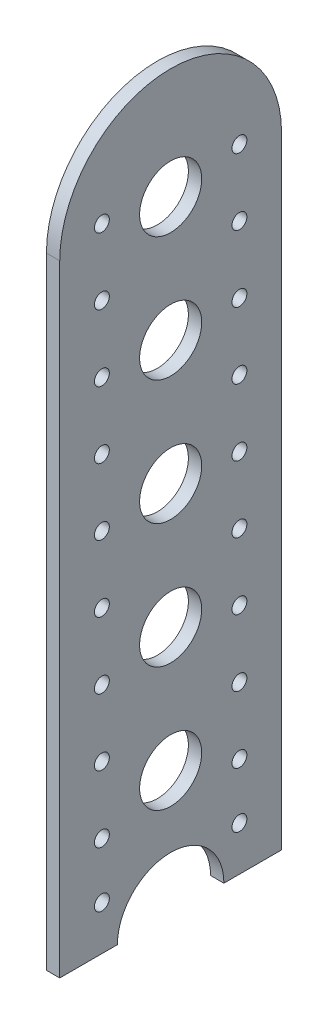
ISO-10303-21;
HEADER;
FILE_DESCRIPTION(('STEP AP214'),'2;1');
FILE_NAME('part.step','',(''),(''),'','','');
FILE_SCHEMA(('AUTOMOTIVE_DESIGN { 1 0 10303 214 1 1 1 1 }'));
ENDSEC;
DATA;
#1=APPLICATION_CONTEXT('core data for automotive mechanical design processes');
#2=APPLICATION_PROTOCOL_DEFINITION('international standard','automotive_design',2000,#1);
#3=PRODUCT_CONTEXT('',#1,'mechanical');
#4=PRODUCT('Part','Part','',(#3));
#5=PRODUCT_RELATED_PRODUCT_CATEGORY('part','',(#4));
#6=PRODUCT_DEFINITION_FORMATION('','',#4);
#7=PRODUCT_DEFINITION_CONTEXT('part definition',#1,'design');
#8=PRODUCT_DEFINITION('design','',#6,#7);
#9=PRODUCT_DEFINITION_SHAPE('','',#8);
#10=(LENGTH_UNIT() NAMED_UNIT(*) SI_UNIT(.MILLI.,.METRE.));
#11=(NAMED_UNIT(*) PLANE_ANGLE_UNIT() SI_UNIT($,.RADIAN.));
#12=(NAMED_UNIT(*) SI_UNIT($,.STERADIAN.) SOLID_ANGLE_UNIT());
#13=UNCERTAINTY_MEASURE_WITH_UNIT(LENGTH_MEASURE(1.E-05),#10,'distance_accuracy_value','');
#14=(GEOMETRIC_REPRESENTATION_CONTEXT(3) GLOBAL_UNCERTAINTY_ASSIGNED_CONTEXT((#13)) GLOBAL_UNIT_ASSIGNED_CONTEXT((#10,
#11,#12)) REPRESENTATION_CONTEXT('',''));
#15=CARTESIAN_POINT('',(0.,0.,0.));
#16=DIRECTION('',(0.,0.,1.));
#17=DIRECTION('',(1.,0.,0.));
#18=AXIS2_PLACEMENT_3D('',#15,#16,#17);
#19=CARTESIAN_POINT('',(3.,56.0448045342148,0.0948683352719054));
#20=DIRECTION('',(1.,0.,0.));
#21=DIRECTION('',(0.,0.,-1.));
#22=AXIS2_PLACEMENT_3D('',#19,#20,#21);
#23=PLANE('',#22);
#24=CARTESIAN_POINT('',(3.,-16.4551960618316,-15.4051320372575));
#25=DIRECTION('',(1.,0.,0.));
#26=DIRECTION('',(0.,0.,-1.));
#27=AXIS2_PLACEMENT_3D('',#24,#25,#26);
#28=CIRCLE('',#27,1.68);
#29=CARTESIAN_POINT('',(3.,-16.4551960618316,-17.0851320372574));
#30=VERTEX_POINT('',#29);
#31=EDGE_CURVE('E327',#30,#30,#28,.T.);
#32=ORIENTED_EDGE('',*,*,#31,.F.);
#33=EDGE_LOOP('',(#32));
#34=FACE_BOUND('',#33,.T.);
#35=CARTESIAN_POINT('',(3.,-1.45519606183174,15.5948687078011));
#36=DIRECTION('',(1.,0.,0.));
#37=DIRECTION('',(0.,0.,-1.));
#38=AXIS2_PLACEMENT_3D('',#35,#36,#37);
#39=CIRCLE('',#38,1.68);
#40=CARTESIAN_POINT('',(3.,-1.45519606183174,13.9148687078011));
#41=VERTEX_POINT('',#40);
#42=EDGE_CURVE('E314',#41,#41,#39,.T.);
#43=ORIENTED_EDGE('',*,*,#42,.F.);
#44=EDGE_LOOP('',(#43));
#45=FACE_BOUND('',#44,.T.);
#46=CARTESIAN_POINT('',(3.,-1.45519606183164,-15.4051320372574));
#47=DIRECTION('',(1.,0.,0.));
#48=DIRECTION('',(0.,0.,-1.));
#49=AXIS2_PLACEMENT_3D('',#46,#47,#48);
#50=CIRCLE('',#49,1.68);
#51=CARTESIAN_POINT('',(3.,-1.45519606183164,-17.0851320372574));
#52=VERTEX_POINT('',#51);
#53=EDGE_CURVE('E315',#52,#52,#50,.T.);
#54=ORIENTED_EDGE('',*,*,#53,.F.);
#55=EDGE_LOOP('',(#54));
#56=FACE_BOUND('',#55,.T.);
#57=CARTESIAN_POINT('',(3.,13.5448039381683,15.5948687078012));
#58=DIRECTION('',(1.,0.,0.));
#59=DIRECTION('',(0.,0.,-1.));
#60=AXIS2_PLACEMENT_3D('',#57,#58,#59);
#61=CIRCLE('',#60,1.68);
#62=CARTESIAN_POINT('',(3.,13.5448039381683,13.9148687078012));
#63=VERTEX_POINT('',#62);
#64=EDGE_CURVE('E302',#63,#63,#61,.T.);
#65=ORIENTED_EDGE('',*,*,#64,.F.);
#66=EDGE_LOOP('',(#65));
#67=FACE_BOUND('',#66,.T.);
#68=CARTESIAN_POINT('',(3.,-46.4551960618316,-15.4051320372576));
#69=DIRECTION('',(1.,0.,0.));
#70=DIRECTION('',(0.,0.,-1.));
#71=AXIS2_PLACEMENT_3D('',#68,#69,#70);
#72=CIRCLE('',#71,1.68);
#73=CARTESIAN_POINT('',(3.,-46.4551960618316,-17.0851320372576));
#74=VERTEX_POINT('',#73);
#75=EDGE_CURVE('E351',#74,#74,#72,.T.);
#76=ORIENTED_EDGE('',*,*,#75,.F.);
#77=EDGE_LOOP('',(#76));
#78=FACE_BOUND('',#77,.T.);
#79=CARTESIAN_POINT('',(3.,-31.4551960618317,15.594868707801));
#80=DIRECTION('',(1.,0.,0.));
#81=DIRECTION('',(0.,0.,-1.));
#82=AXIS2_PLACEMENT_3D('',#79,#80,#81);
#83=CIRCLE('',#82,1.68);
#84=CARTESIAN_POINT('',(3.,-31.4551960618317,13.914868707801));
#85=VERTEX_POINT('',#84);
#86=EDGE_CURVE('E338',#85,#85,#83,.T.);
#87=ORIENTED_EDGE('',*,*,#86,.F.);
#88=EDGE_LOOP('',(#87));
#89=FACE_BOUND('',#88,.T.);
#90=CARTESIAN_POINT('',(3.,-31.4551960618316,-15.4051320372575));
#91=DIRECTION('',(1.,0.,0.));
#92=DIRECTION('',(0.,0.,-1.));
#93=AXIS2_PLACEMENT_3D('',#90,#91,#92);
#94=CIRCLE('',#93,1.68);
#95=CARTESIAN_POINT('',(3.,-31.4551960618316,-17.0851320372575));
#96=VERTEX_POINT('',#95);
#97=EDGE_CURVE('E339',#96,#96,#94,.T.);
#98=ORIENTED_EDGE('',*,*,#97,.F.);
#99=EDGE_LOOP('',(#98));
#100=FACE_BOUND('',#99,.T.);
#101=CARTESIAN_POINT('',(3.,-16.4551960618317,15.5948687078011));
#102=DIRECTION('',(1.,0.,0.));
#103=DIRECTION('',(0.,0.,-1.));
#104=AXIS2_PLACEMENT_3D('',#101,#102,#103);
#105=CIRCLE('',#104,1.68);
#106=CARTESIAN_POINT('',(3.,-16.4551960618317,13.9148687078011));
#107=VERTEX_POINT('',#106);
#108=EDGE_CURVE('E326',#107,#107,#105,.T.);
#109=ORIENTED_EDGE('',*,*,#108,.F.);
#110=EDGE_LOOP('',(#109));
#111=FACE_BOUND('',#110,.T.);
#112=CARTESIAN_POINT('',(3.,43.5448039381684,-15.4051320372572));
#113=DIRECTION('',(1.,0.,0.));
#114=DIRECTION('',(0.,0.,-1.));
#115=AXIS2_PLACEMENT_3D('',#112,#113,#114);
#116=CIRCLE('',#115,1.68);
#117=CARTESIAN_POINT('',(3.,43.5448039381684,-17.0851320372572));
#118=VERTEX_POINT('',#117);
#119=EDGE_CURVE('E279',#118,#118,#116,.T.);
#120=ORIENTED_EDGE('',*,*,#119,.F.);
#121=EDGE_LOOP('',(#120));
#122=FACE_BOUND('',#121,.T.);
#123=CARTESIAN_POINT('',(3.,58.5448039381683,15.5948687078014));
#124=DIRECTION('',(1.,0.,0.));
#125=DIRECTION('',(0.,0.,-1.));
#126=AXIS2_PLACEMENT_3D('',#123,#124,#125);
#127=CIRCLE('',#126,1.68);
#128=CARTESIAN_POINT('',(3.,58.5448039381683,13.9148687078013));
#129=VERTEX_POINT('',#128);
#130=EDGE_CURVE('E272',#129,#129,#127,.T.);
#131=ORIENTED_EDGE('',*,*,#130,.F.);
#132=EDGE_LOOP('',(#131));
#133=FACE_BOUND('',#132,.T.);
#134=CARTESIAN_POINT('',(3.,58.5448039381684,-15.4051320372572));
#135=DIRECTION('',(1.,0.,0.));
#136=DIRECTION('',(0.,0.,-1.));
#137=AXIS2_PLACEMENT_3D('',#134,#135,#136);
#138=CIRCLE('',#137,1.68);
#139=CARTESIAN_POINT('',(3.,58.5448039381684,-17.0851320372572));
#140=VERTEX_POINT('',#139);
#141=EDGE_CURVE('E269',#140,#140,#138,.T.);
#142=ORIENTED_EDGE('',*,*,#141,.F.);
#143=EDGE_LOOP('',(#142));
#144=FACE_BOUND('',#143,.T.);
#145=CARTESIAN_POINT('',(3.,13.5448039381684,-15.4051320372574));
#146=DIRECTION('',(1.,0.,0.));
#147=DIRECTION('',(0.,0.,-1.));
#148=AXIS2_PLACEMENT_3D('',#145,#146,#147);
#149=CIRCLE('',#148,1.68);
#150=CARTESIAN_POINT('',(3.,13.5448039381684,-17.0851320372573));
#151=VERTEX_POINT('',#150);
#152=EDGE_CURVE('E303',#151,#151,#149,.T.);
#153=ORIENTED_EDGE('',*,*,#152,.F.);
#154=EDGE_LOOP('',(#153));
#155=FACE_BOUND('',#154,.T.);
#156=CARTESIAN_POINT('',(3.,28.5448039381683,15.5948687078012));
#157=DIRECTION('',(1.,0.,0.));
#158=DIRECTION('',(0.,0.,-1.));
#159=AXIS2_PLACEMENT_3D('',#156,#157,#158);
#160=CIRCLE('',#159,1.68);
#161=CARTESIAN_POINT('',(3.,28.5448039381683,13.9148687078012));
#162=VERTEX_POINT('',#161);
#163=EDGE_CURVE('E290',#162,#162,#160,.T.);
#164=ORIENTED_EDGE('',*,*,#163,.F.);
#165=EDGE_LOOP('',(#164));
#166=FACE_BOUND('',#165,.T.);
#167=CARTESIAN_POINT('',(3.,28.5448039381684,-15.4051320372573));
#168=DIRECTION('',(1.,0.,0.));
#169=DIRECTION('',(0.,0.,-1.));
#170=AXIS2_PLACEMENT_3D('',#167,#168,#169);
#171=CIRCLE('',#170,1.68);
#172=CARTESIAN_POINT('',(3.,28.5448039381684,-17.0851320372573));
#173=VERTEX_POINT('',#172);
#174=EDGE_CURVE('E291',#173,#173,#171,.T.);
#175=ORIENTED_EDGE('',*,*,#174,.F.);
#176=EDGE_LOOP('',(#175));
#177=FACE_BOUND('',#176,.T.);
#178=CARTESIAN_POINT('',(3.,43.5448039381683,15.5948687078013));
#179=DIRECTION('',(1.,0.,0.));
#180=DIRECTION('',(0.,0.,-1.));
#181=AXIS2_PLACEMENT_3D('',#178,#179,#180);
#182=CIRCLE('',#181,1.68);
#183=CARTESIAN_POINT('',(3.,43.5448039381683,13.9148687078013));
#184=VERTEX_POINT('',#183);
#185=EDGE_CURVE('E278',#184,#184,#182,.T.);
#186=ORIENTED_EDGE('',*,*,#185,.F.);
#187=EDGE_LOOP('',(#186));
#188=FACE_BOUND('',#187,.T.);
#189=CARTESIAN_POINT('',(3.,-46.4551960618317,15.594868707801));
#190=DIRECTION('',(1.,0.,0.));
#191=DIRECTION('',(0.,0.,-1.));
#192=AXIS2_PLACEMENT_3D('',#189,#190,#191);
#193=CIRCLE('',#192,1.68);
#194=CARTESIAN_POINT('',(3.,-46.4551960618317,13.914868707801));
#195=VERTEX_POINT('',#194);
#196=EDGE_CURVE('E350',#195,#195,#193,.T.);
#197=ORIENTED_EDGE('',*,*,#196,.F.);
#198=EDGE_LOOP('',(#197));
#199=FACE_BOUND('',#198,.T.);
#200=CARTESIAN_POINT('',(3.,-61.4551960618317,15.5948687078009));
#201=DIRECTION('',(1.,0.,0.));
#202=DIRECTION('',(0.,0.,-1.));
#203=AXIS2_PLACEMENT_3D('',#200,#201,#202);
#204=CIRCLE('',#203,1.68);
#205=CARTESIAN_POINT('',(3.,-61.4551960618317,13.9148687078009));
#206=VERTEX_POINT('',#205);
#207=EDGE_CURVE('E369',#206,#206,#204,.T.);
#208=ORIENTED_EDGE('',*,*,#207,.F.);
#209=EDGE_LOOP('',(#208));
#210=FACE_BOUND('',#209,.T.);
#211=CARTESIAN_POINT('',(3.,-61.4551960618316,-15.4051320372576));
#212=DIRECTION('',(1.,0.,0.));
#213=DIRECTION('',(0.,0.,-1.));
#214=AXIS2_PLACEMENT_3D('',#211,#212,#213);
#215=CIRCLE('',#214,1.68);
#216=CARTESIAN_POINT('',(3.,-61.4551960618316,-17.0851320372576));
#217=VERTEX_POINT('',#216);
#218=EDGE_CURVE('E362',#217,#217,#215,.T.);
#219=ORIENTED_EDGE('',*,*,#218,.F.);
#220=EDGE_LOOP('',(#219));
#221=FACE_BOUND('',#220,.T.);
#222=CARTESIAN_POINT('',(3.,-73.9551960618317,15.5948687078009));
#223=DIRECTION('',(1.,0.,0.));
#224=DIRECTION('',(0.,0.,-1.));
#225=AXIS2_PLACEMENT_3D('',#222,#223,#224);
#226=CIRCLE('',#225,1.68);
#227=CARTESIAN_POINT('',(3.,-73.9551960618317,13.9148687078009));
#228=VERTEX_POINT('',#227);
#229=EDGE_CURVE('E381',#228,#228,#226,.T.);
#230=ORIENTED_EDGE('',*,*,#229,.F.);
#231=EDGE_LOOP('',(#230));
#232=FACE_BOUND('',#231,.T.);
#233=CARTESIAN_POINT('',(3.,-73.9551960618316,-15.4051320372576));
#234=DIRECTION('',(1.,0.,0.));
#235=DIRECTION('',(0.,0.,-1.));
#236=AXIS2_PLACEMENT_3D('',#233,#234,#235);
#237=CIRCLE('',#236,1.68);
#238=CARTESIAN_POINT('',(3.,-73.9551960618316,-17.0851320372576));
#239=VERTEX_POINT('',#238);
#240=EDGE_CURVE('E368',#239,#239,#237,.T.);
#241=ORIENTED_EDGE('',*,*,#240,.F.);
#242=EDGE_LOOP('',(#241));
#243=FACE_BOUND('',#242,.T.);
#244=CARTESIAN_POINT('',(3.,28.0448654967271,0.0948065084920985));
#245=DIRECTION('',(1.,0.,0.));
#246=DIRECTION('',(0.,0.,-1.));
#247=AXIS2_PLACEMENT_3D('',#244,#245,#246);
#248=CIRCLE('',#247,6.99993299369759);
#249=CARTESIAN_POINT('',(3.,28.0448654967271,-6.90512648520549));
#250=VERTEX_POINT('',#249);
#251=EDGE_CURVE('E395',#250,#250,#248,.T.);
#252=ORIENTED_EDGE('',*,*,#251,.F.);
#253=EDGE_LOOP('',(#252));
#254=FACE_BOUND('',#253,.T.);
#255=CARTESIAN_POINT('',(3.,-27.955201843483,0.0948365393710349));
#256=DIRECTION('',(1.,0.,0.));
#257=DIRECTION('',(0.,0.,-1.));
#258=AXIS2_PLACEMENT_3D('',#255,#256,#257);
#259=CIRCLE('',#258,6.9999950310871);
#260=CARTESIAN_POINT('',(3.,-27.955201843483,-6.90515849171606));
#261=VERTEX_POINT('',#260);
#262=EDGE_CURVE('E407',#261,#261,#259,.T.);
#263=ORIENTED_EDGE('',*,*,#262,.F.);
#264=EDGE_LOOP('',(#263));
#265=FACE_BOUND('',#264,.T.);
#266=DIRECTION('',(0.,-1.,0.));
#267=VECTOR('',#266,1.);
#268=CARTESIAN_POINT('',(3.,-83.9551960618317,25.0948687078005));
#269=LINE('',#268,#267);
#270=CARTESIAN_POINT('',(3.,56.0448045342148,25.0948687078009));
#271=VERTEX_POINT('',#270);
#272=CARTESIAN_POINT('',(3.,-83.9551960618317,25.0948687078005));
#273=VERTEX_POINT('',#272);
#274=EDGE_CURVE('E130',#271,#273,#269,.T.);
#275=ORIENTED_EDGE('',*,*,#274,.T.);
#276=DIRECTION('',(0.,0.,-1.));
#277=VECTOR('',#276,1.);
#278=CARTESIAN_POINT('',(3.,-83.9551960618317,25.0948687078005));
#279=LINE('',#278,#277);
#280=CARTESIAN_POINT('',(3.,-83.9551960618317,12.0948684395795));
#281=VERTEX_POINT('',#280);
#282=EDGE_CURVE('E88',#273,#281,#279,.T.);
#283=ORIENTED_EDGE('',*,*,#282,.T.);
#284=CARTESIAN_POINT('',(3.,-83.9551960618317,0.0948683352714197));
#285=DIRECTION('',(-1.,0.,0.));
#286=DIRECTION('',(0.,0.,-1.));
#287=AXIS2_PLACEMENT_3D('',#284,#285,#286);
#288=CIRCLE('',#287,12.0000001043081);
#289=CARTESIAN_POINT('',(3.,-83.9551960618316,-11.9051317690367));
#290=VERTEX_POINT('',#289);
#291=EDGE_CURVE('E101',#281,#290,#288,.T.);
#292=ORIENTED_EDGE('',*,*,#291,.T.);
#293=DIRECTION('',(0.,0.,-1.));
#294=VECTOR('',#293,1.);
#295=CARTESIAN_POINT('',(3.,-83.9551960618316,-11.9051317690367));
#296=LINE('',#295,#294);
#297=CARTESIAN_POINT('',(3.,-83.9551960618316,-24.9051320372576));
#298=VERTEX_POINT('',#297);
#299=EDGE_CURVE('E95',#290,#298,#296,.T.);
#300=ORIENTED_EDGE('',*,*,#299,.T.);
#301=DIRECTION('',(0.,1.,0.));
#302=VECTOR('',#301,1.);
#303=CARTESIAN_POINT('',(3.,-83.9551960618316,-24.9051320372576));
#304=LINE('',#303,#302);
#305=CARTESIAN_POINT('',(3.,56.0448045342149,-24.9051320372576));
#306=VERTEX_POINT('',#305);
#307=EDGE_CURVE('E99',#298,#306,#304,.T.);
#308=ORIENTED_EDGE('',*,*,#307,.T.);
#309=CARTESIAN_POINT('',(3.,56.0448045342148,0.0948683352719054));
#310=DIRECTION('',(1.,0.,0.));
#311=DIRECTION('',(0.,0.,-1.));
#312=AXIS2_PLACEMENT_3D('',#309,#310,#311);
#313=CIRCLE('',#312,25.000000372529);
#314=EDGE_CURVE('E51',#306,#271,#313,.T.);
#315=ORIENTED_EDGE('',*,*,#314,.T.);
#316=EDGE_LOOP('',(#275,#283,#292,#300,#308,#315));
#317=FACE_BOUND('',#316,.T.);
#318=CARTESIAN_POINT('',(3.,-55.9551761251532,0.0948683352715168));
#319=DIRECTION('',(1.,0.,0.));
#320=DIRECTION('',(0.,0.,-1.));
#321=AXIS2_PLACEMENT_3D('',#318,#319,#320);
#322=CIRCLE('',#321,7.00000114741539);
#323=CARTESIAN_POINT('',(3.,-55.9551761251532,-6.90513281214387));
#324=VERTEX_POINT('',#323);
#325=EDGE_CURVE('E123',#324,#324,#322,.T.);
#326=ORIENTED_EDGE('',*,*,#325,.F.);
#327=EDGE_LOOP('',(#326));
#328=FACE_BOUND('',#327,.T.);
#329=CARTESIAN_POINT('',(3.,0.0448024489419288,0.0949228919264189));
#330=DIRECTION('',(1.,0.,0.));
#331=DIRECTION('',(0.,0.,-1.));
#332=AXIS2_PLACEMENT_3D('',#329,#330,#331);
#333=CIRCLE('',#332,6.99997313997084);
#334=CARTESIAN_POINT('',(3.,0.0448024489419288,-6.90505024804442));
#335=VERTEX_POINT('',#334);
#336=EDGE_CURVE('E401',#335,#335,#333,.T.);
#337=ORIENTED_EDGE('',*,*,#336,.F.);
#338=EDGE_LOOP('',(#337));
#339=FACE_BOUND('',#338,.T.);
#340=CARTESIAN_POINT('',(3.,56.0447469854934,0.0948683352718915));
#341=DIRECTION('',(1.,0.,0.));
#342=DIRECTION('',(0.,0.,-1.));
#343=AXIS2_PLACEMENT_3D('',#340,#341,#342);
#344=CIRCLE('',#343,6.99997105216811);
#345=CARTESIAN_POINT('',(3.,56.0447469854934,-6.90510271689622));
#346=VERTEX_POINT('',#345);
#347=EDGE_CURVE('E389',#346,#346,#344,.T.);
#348=ORIENTED_EDGE('',*,*,#347,.F.);
#349=EDGE_LOOP('',(#348));
#350=FACE_BOUND('',#349,.T.);
#351=ADVANCED_FACE('F34',(#34,#45,#56,#67,#78,#89,#100,#111,#122,#133,#144,#155,#166,#177,#188,
#199,#210,#221,#232,#243,#254,#265,#317,#328,#339,#350),#23,.T.);
#352=CARTESIAN_POINT('',(0.,56.0448045342148,0.0948683352719054));
#353=DIRECTION('',(1.,0.,0.));
#354=DIRECTION('',(0.,0.,-1.));
#355=AXIS2_PLACEMENT_3D('',#352,#353,#354);
#356=PLANE('',#355);
#357=CARTESIAN_POINT('',(0.,-16.4551960618316,-15.4051320372575));
#358=DIRECTION('',(1.,0.,0.));
#359=DIRECTION('',(0.,0.,-1.));
#360=AXIS2_PLACEMENT_3D('',#357,#358,#359);
#361=CIRCLE('',#360,1.68);
#362=CARTESIAN_POINT('',(0.,-16.4551960618316,-17.0851320372574));
#363=VERTEX_POINT('',#362);
#364=EDGE_CURVE('E323',#363,#363,#361,.T.);
#365=ORIENTED_EDGE('',*,*,#364,.T.);
#366=EDGE_LOOP('',(#365));
#367=FACE_BOUND('',#366,.T.);
#368=CARTESIAN_POINT('',(0.,-1.45519606183174,15.5948687078011));
#369=DIRECTION('',(1.,0.,0.));
#370=DIRECTION('',(0.,0.,-1.));
#371=AXIS2_PLACEMENT_3D('',#368,#369,#370);
#372=CIRCLE('',#371,1.68);
#373=CARTESIAN_POINT('',(0.,-1.45519606183174,13.9148687078011));
#374=VERTEX_POINT('',#373);
#375=EDGE_CURVE('E330',#374,#374,#372,.T.);
#376=ORIENTED_EDGE('',*,*,#375,.T.);
#377=EDGE_LOOP('',(#376));
#378=FACE_BOUND('',#377,.T.);
#379=CARTESIAN_POINT('',(0.,-1.45519606183164,-15.4051320372574));
#380=DIRECTION('',(1.,0.,0.));
#381=DIRECTION('',(0.,0.,-1.));
#382=AXIS2_PLACEMENT_3D('',#379,#380,#381);
#383=CIRCLE('',#382,1.68);
#384=CARTESIAN_POINT('',(0.,-1.45519606183164,-17.0851320372574));
#385=VERTEX_POINT('',#384);
#386=EDGE_CURVE('E311',#385,#385,#383,.T.);
#387=ORIENTED_EDGE('',*,*,#386,.T.);
#388=EDGE_LOOP('',(#387));
#389=FACE_BOUND('',#388,.T.);
#390=CARTESIAN_POINT('',(0.,13.5448039381683,15.5948687078012));
#391=DIRECTION('',(1.,0.,0.));
#392=DIRECTION('',(0.,0.,-1.));
#393=AXIS2_PLACEMENT_3D('',#390,#391,#392);
#394=CIRCLE('',#393,1.68);
#395=CARTESIAN_POINT('',(0.,13.5448039381683,13.9148687078012));
#396=VERTEX_POINT('',#395);
#397=EDGE_CURVE('E318',#396,#396,#394,.T.);
#398=ORIENTED_EDGE('',*,*,#397,.T.);
#399=EDGE_LOOP('',(#398));
#400=FACE_BOUND('',#399,.T.);
#401=CARTESIAN_POINT('',(0.,-46.4551960618316,-15.4051320372576));
#402=DIRECTION('',(1.,0.,0.));
#403=DIRECTION('',(0.,0.,-1.));
#404=AXIS2_PLACEMENT_3D('',#401,#402,#403);
#405=CIRCLE('',#404,1.68);
#406=CARTESIAN_POINT('',(0.,-46.4551960618316,-17.0851320372576));
#407=VERTEX_POINT('',#406);
#408=EDGE_CURVE('E347',#407,#407,#405,.T.);
#409=ORIENTED_EDGE('',*,*,#408,.T.);
#410=EDGE_LOOP('',(#409));
#411=FACE_BOUND('',#410,.T.);
#412=CARTESIAN_POINT('',(0.,-31.4551960618317,15.594868707801));
#413=DIRECTION('',(1.,0.,0.));
#414=DIRECTION('',(0.,0.,-1.));
#415=AXIS2_PLACEMENT_3D('',#412,#413,#414);
#416=CIRCLE('',#415,1.68);
#417=CARTESIAN_POINT('',(0.,-31.4551960618317,13.914868707801));
#418=VERTEX_POINT('',#417);
#419=EDGE_CURVE('E354',#418,#418,#416,.T.);
#420=ORIENTED_EDGE('',*,*,#419,.T.);
#421=EDGE_LOOP('',(#420));
#422=FACE_BOUND('',#421,.T.);
#423=CARTESIAN_POINT('',(0.,-31.4551960618316,-15.4051320372575));
#424=DIRECTION('',(1.,0.,0.));
#425=DIRECTION('',(0.,0.,-1.));
#426=AXIS2_PLACEMENT_3D('',#423,#424,#425);
#427=CIRCLE('',#426,1.68);
#428=CARTESIAN_POINT('',(0.,-31.4551960618316,-17.0851320372575));
#429=VERTEX_POINT('',#428);
#430=EDGE_CURVE('E335',#429,#429,#427,.T.);
#431=ORIENTED_EDGE('',*,*,#430,.T.);
#432=EDGE_LOOP('',(#431));
#433=FACE_BOUND('',#432,.T.);
#434=CARTESIAN_POINT('',(0.,-16.4551960618317,15.5948687078011));
#435=DIRECTION('',(1.,0.,0.));
#436=DIRECTION('',(0.,0.,-1.));
#437=AXIS2_PLACEMENT_3D('',#434,#435,#436);
#438=CIRCLE('',#437,1.68);
#439=CARTESIAN_POINT('',(0.,-16.4551960618317,13.9148687078011));
#440=VERTEX_POINT('',#439);
#441=EDGE_CURVE('E342',#440,#440,#438,.T.);
#442=ORIENTED_EDGE('',*,*,#441,.T.);
#443=EDGE_LOOP('',(#442));
#444=FACE_BOUND('',#443,.T.);
#445=CARTESIAN_POINT('',(0.,43.5448039381684,-15.4051320372572));
#446=DIRECTION('',(1.,0.,0.));
#447=DIRECTION('',(0.,0.,-1.));
#448=AXIS2_PLACEMENT_3D('',#445,#446,#447);
#449=CIRCLE('',#448,1.68);
#450=CARTESIAN_POINT('',(0.,43.5448039381684,-17.0851320372572));
#451=VERTEX_POINT('',#450);
#452=EDGE_CURVE('E275',#451,#451,#449,.T.);
#453=ORIENTED_EDGE('',*,*,#452,.T.);
#454=EDGE_LOOP('',(#453));
#455=FACE_BOUND('',#454,.T.);
#456=CARTESIAN_POINT('',(0.,58.5448039381683,15.5948687078014));
#457=DIRECTION('',(1.,0.,0.));
#458=DIRECTION('',(0.,0.,-1.));
#459=AXIS2_PLACEMENT_3D('',#456,#457,#458);
#460=CIRCLE('',#459,1.68);
#461=CARTESIAN_POINT('',(0.,58.5448039381683,13.9148687078013));
#462=VERTEX_POINT('',#461);
#463=EDGE_CURVE('E282',#462,#462,#460,.T.);
#464=ORIENTED_EDGE('',*,*,#463,.T.);
#465=EDGE_LOOP('',(#464));
#466=FACE_BOUND('',#465,.T.);
#467=CARTESIAN_POINT('',(0.,58.5448039381684,-15.4051320372572));
#468=DIRECTION('',(1.,0.,0.));
#469=DIRECTION('',(0.,0.,-1.));
#470=AXIS2_PLACEMENT_3D('',#467,#468,#469);
#471=CIRCLE('',#470,1.68);
#472=CARTESIAN_POINT('',(0.,58.5448039381684,-17.0851320372572));
#473=VERTEX_POINT('',#472);
#474=EDGE_CURVE('E266',#473,#473,#471,.T.);
#475=ORIENTED_EDGE('',*,*,#474,.T.);
#476=EDGE_LOOP('',(#475));
#477=FACE_BOUND('',#476,.T.);
#478=CARTESIAN_POINT('',(0.,13.5448039381684,-15.4051320372574));
#479=DIRECTION('',(1.,0.,0.));
#480=DIRECTION('',(0.,0.,-1.));
#481=AXIS2_PLACEMENT_3D('',#478,#479,#480);
#482=CIRCLE('',#481,1.68);
#483=CARTESIAN_POINT('',(0.,13.5448039381684,-17.0851320372573));
#484=VERTEX_POINT('',#483);
#485=EDGE_CURVE('E299',#484,#484,#482,.T.);
#486=ORIENTED_EDGE('',*,*,#485,.T.);
#487=EDGE_LOOP('',(#486));
#488=FACE_BOUND('',#487,.T.);
#489=CARTESIAN_POINT('',(0.,28.5448039381683,15.5948687078012));
#490=DIRECTION('',(1.,0.,0.));
#491=DIRECTION('',(0.,0.,-1.));
#492=AXIS2_PLACEMENT_3D('',#489,#490,#491);
#493=CIRCLE('',#492,1.68);
#494=CARTESIAN_POINT('',(0.,28.5448039381683,13.9148687078012));
#495=VERTEX_POINT('',#494);
#496=EDGE_CURVE('E306',#495,#495,#493,.T.);
#497=ORIENTED_EDGE('',*,*,#496,.T.);
#498=EDGE_LOOP('',(#497));
#499=FACE_BOUND('',#498,.T.);
#500=CARTESIAN_POINT('',(0.,28.5448039381684,-15.4051320372573));
#501=DIRECTION('',(1.,0.,0.));
#502=DIRECTION('',(0.,0.,-1.));
#503=AXIS2_PLACEMENT_3D('',#500,#501,#502);
#504=CIRCLE('',#503,1.68);
#505=CARTESIAN_POINT('',(0.,28.5448039381684,-17.0851320372573));
#506=VERTEX_POINT('',#505);
#507=EDGE_CURVE('E287',#506,#506,#504,.T.);
#508=ORIENTED_EDGE('',*,*,#507,.T.);
#509=EDGE_LOOP('',(#508));
#510=FACE_BOUND('',#509,.T.);
#511=CARTESIAN_POINT('',(0.,43.5448039381683,15.5948687078013));
#512=DIRECTION('',(1.,0.,0.));
#513=DIRECTION('',(0.,0.,-1.));
#514=AXIS2_PLACEMENT_3D('',#511,#512,#513);
#515=CIRCLE('',#514,1.68);
#516=CARTESIAN_POINT('',(0.,43.5448039381683,13.9148687078013));
#517=VERTEX_POINT('',#516);
#518=EDGE_CURVE('E294',#517,#517,#515,.T.);
#519=ORIENTED_EDGE('',*,*,#518,.T.);
#520=EDGE_LOOP('',(#519));
#521=FACE_BOUND('',#520,.T.);
#522=CARTESIAN_POINT('',(0.,-46.4551960618317,15.594868707801));
#523=DIRECTION('',(1.,0.,0.));
#524=DIRECTION('',(0.,0.,-1.));
#525=AXIS2_PLACEMENT_3D('',#522,#523,#524);
#526=CIRCLE('',#525,1.68);
#527=CARTESIAN_POINT('',(0.,-46.4551960618317,13.914868707801));
#528=VERTEX_POINT('',#527);
#529=EDGE_CURVE('E359',#528,#528,#526,.T.);
#530=ORIENTED_EDGE('',*,*,#529,.T.);
#531=EDGE_LOOP('',(#530));
#532=FACE_BOUND('',#531,.T.);
#533=CARTESIAN_POINT('',(0.,-61.4551960618317,15.5948687078009));
#534=DIRECTION('',(1.,0.,0.));
#535=DIRECTION('',(0.,0.,-1.));
#536=AXIS2_PLACEMENT_3D('',#533,#534,#535);
#537=CIRCLE('',#536,1.68);
#538=CARTESIAN_POINT('',(0.,-61.4551960618317,13.9148687078009));
#539=VERTEX_POINT('',#538);
#540=EDGE_CURVE('E365',#539,#539,#537,.T.);
#541=ORIENTED_EDGE('',*,*,#540,.T.);
#542=EDGE_LOOP('',(#541));
#543=FACE_BOUND('',#542,.T.);
#544=CARTESIAN_POINT('',(0.,-61.4551960618316,-15.4051320372576));
#545=DIRECTION('',(1.,0.,0.));
#546=DIRECTION('',(0.,0.,-1.));
#547=AXIS2_PLACEMENT_3D('',#544,#545,#546);
#548=CIRCLE('',#547,1.68);
#549=CARTESIAN_POINT('',(0.,-61.4551960618316,-17.0851320372576));
#550=VERTEX_POINT('',#549);
#551=EDGE_CURVE('E372',#550,#550,#548,.T.);
#552=ORIENTED_EDGE('',*,*,#551,.T.);
#553=EDGE_LOOP('',(#552));
#554=FACE_BOUND('',#553,.T.);
#555=CARTESIAN_POINT('',(0.,-73.9551960618317,15.5948687078009));
#556=DIRECTION('',(1.,0.,0.));
#557=DIRECTION('',(0.,0.,-1.));
#558=AXIS2_PLACEMENT_3D('',#555,#556,#557);
#559=CIRCLE('',#558,1.68);
#560=CARTESIAN_POINT('',(0.,-73.9551960618317,13.9148687078009));
#561=VERTEX_POINT('',#560);
#562=EDGE_CURVE('E377',#561,#561,#559,.T.);
#563=ORIENTED_EDGE('',*,*,#562,.T.);
#564=EDGE_LOOP('',(#563));
#565=FACE_BOUND('',#564,.T.);
#566=CARTESIAN_POINT('',(0.,-73.9551960618316,-15.4051320372576));
#567=DIRECTION('',(1.,0.,0.));
#568=DIRECTION('',(0.,0.,-1.));
#569=AXIS2_PLACEMENT_3D('',#566,#567,#568);
#570=CIRCLE('',#569,1.68);
#571=CARTESIAN_POINT('',(0.,-73.9551960618316,-17.0851320372576));
#572=VERTEX_POINT('',#571);
#573=EDGE_CURVE('E384',#572,#572,#570,.T.);
#574=ORIENTED_EDGE('',*,*,#573,.T.);
#575=EDGE_LOOP('',(#574));
#576=FACE_BOUND('',#575,.T.);
#577=DIRECTION('',(0.,-1.,0.));
#578=VECTOR('',#577,1.);
#579=CARTESIAN_POINT('',(0.,-83.9551960618317,25.0948687078005));
#580=LINE('',#579,#578);
#581=CARTESIAN_POINT('',(0.,56.0448045342148,25.0948687078009));
#582=VERTEX_POINT('',#581);
#583=CARTESIAN_POINT('',(0.,-83.9551960618317,25.0948687078005));
#584=VERTEX_POINT('',#583);
#585=EDGE_CURVE('E119',#582,#584,#580,.T.);
#586=ORIENTED_EDGE('',*,*,#585,.F.);
#587=CARTESIAN_POINT('',(0.,56.0448045342148,0.0948683352719054));
#588=DIRECTION('',(1.,0.,0.));
#589=DIRECTION('',(0.,0.,-1.));
#590=AXIS2_PLACEMENT_3D('',#587,#588,#589);
#591=CIRCLE('',#590,25.000000372529);
#592=CARTESIAN_POINT('',(0.,56.0448045342149,-24.9051320372576));
#593=VERTEX_POINT('',#592);
#594=EDGE_CURVE('E80',#593,#582,#591,.T.);
#595=ORIENTED_EDGE('',*,*,#594,.F.);
#596=DIRECTION('',(0.,1.,0.));
#597=VECTOR('',#596,1.);
#598=CARTESIAN_POINT('',(0.,-83.9551960618316,-24.9051320372576));
#599=LINE('',#598,#597);
#600=CARTESIAN_POINT('',(0.,-83.9551960618316,-24.9051320372576));
#601=VERTEX_POINT('',#600);
#602=EDGE_CURVE('E74',#601,#593,#599,.T.);
#603=ORIENTED_EDGE('',*,*,#602,.F.);
#604=DIRECTION('',(0.,0.,-1.));
#605=VECTOR('',#604,1.);
#606=CARTESIAN_POINT('',(0.,-83.9551960618316,-11.9051317690367));
#607=LINE('',#606,#605);
#608=CARTESIAN_POINT('',(0.,-83.9551960618316,-11.9051317690367));
#609=VERTEX_POINT('',#608);
#610=EDGE_CURVE('E109',#609,#601,#607,.T.);
#611=ORIENTED_EDGE('',*,*,#610,.F.);
#612=CARTESIAN_POINT('',(0.,-83.9551960618317,0.0948683352714197));
#613=DIRECTION('',(-1.,0.,0.));
#614=DIRECTION('',(0.,0.,-1.));
#615=AXIS2_PLACEMENT_3D('',#612,#613,#614);
#616=CIRCLE('',#615,12.0000001043081);
#617=CARTESIAN_POINT('',(0.,-83.9551960618317,12.0948684395795));
#618=VERTEX_POINT('',#617);
#619=EDGE_CURVE('E125',#618,#609,#616,.T.);
#620=ORIENTED_EDGE('',*,*,#619,.F.);
#621=DIRECTION('',(0.,0.,-1.));
#622=VECTOR('',#621,1.);
#623=CARTESIAN_POINT('',(0.,-83.9551960618317,25.0948687078005));
#624=LINE('',#623,#622);
#625=EDGE_CURVE('E122',#584,#618,#624,.T.);
#626=ORIENTED_EDGE('',*,*,#625,.F.);
#627=EDGE_LOOP('',(#586,#595,#603,#611,#620,#626));
#628=FACE_BOUND('',#627,.T.);
#629=CARTESIAN_POINT('',(0.,-55.9551761251532,0.0948683352715168));
#630=DIRECTION('',(1.,0.,0.));
#631=DIRECTION('',(0.,0.,-1.));
#632=AXIS2_PLACEMENT_3D('',#629,#630,#631);
#633=CIRCLE('',#632,7.00000114741539);
#634=CARTESIAN_POINT('',(0.,-55.9551761251532,-6.90513281214387));
#635=VERTEX_POINT('',#634);
#636=EDGE_CURVE('E410',#635,#635,#633,.T.);
#637=ORIENTED_EDGE('',*,*,#636,.T.);
#638=EDGE_LOOP('',(#637));
#639=FACE_BOUND('',#638,.T.);
#640=CARTESIAN_POINT('',(0.,-27.955201843483,0.0948365393710349));
#641=DIRECTION('',(1.,0.,0.));
#642=DIRECTION('',(0.,0.,-1.));
#643=AXIS2_PLACEMENT_3D('',#640,#641,#642);
#644=CIRCLE('',#643,6.9999950310871);
#645=CARTESIAN_POINT('',(0.,-27.955201843483,-6.90515849171606));
#646=VERTEX_POINT('',#645);
#647=EDGE_CURVE('E404',#646,#646,#644,.T.);
#648=ORIENTED_EDGE('',*,*,#647,.T.);
#649=EDGE_LOOP('',(#648));
#650=FACE_BOUND('',#649,.T.);
#651=CARTESIAN_POINT('',(0.,0.0448024489419288,0.0949228919264189));
#652=DIRECTION('',(1.,0.,0.));
#653=DIRECTION('',(0.,0.,-1.));
#654=AXIS2_PLACEMENT_3D('',#651,#652,#653);
#655=CIRCLE('',#654,6.99997313997084);
#656=CARTESIAN_POINT('',(0.,0.0448024489419288,-6.90505024804442));
#657=VERTEX_POINT('',#656);
#658=EDGE_CURVE('E398',#657,#657,#655,.T.);
#659=ORIENTED_EDGE('',*,*,#658,.T.);
#660=EDGE_LOOP('',(#659));
#661=FACE_BOUND('',#660,.T.);
#662=CARTESIAN_POINT('',(0.,28.0448654967271,0.0948065084920985));
#663=DIRECTION('',(1.,0.,0.));
#664=DIRECTION('',(0.,0.,-1.));
#665=AXIS2_PLACEMENT_3D('',#662,#663,#664);
#666=CIRCLE('',#665,6.99993299369759);
#667=CARTESIAN_POINT('',(0.,28.0448654967271,-6.90512648520549));
#668=VERTEX_POINT('',#667);
#669=EDGE_CURVE('E392',#668,#668,#666,.T.);
#670=ORIENTED_EDGE('',*,*,#669,.T.);
#671=EDGE_LOOP('',(#670));
#672=FACE_BOUND('',#671,.T.);
#673=CARTESIAN_POINT('',(0.,56.0447469854934,0.0948683352718915));
#674=DIRECTION('',(1.,0.,0.));
#675=DIRECTION('',(0.,0.,-1.));
#676=AXIS2_PLACEMENT_3D('',#673,#674,#675);
#677=CIRCLE('',#676,6.99997105216811);
#678=CARTESIAN_POINT('',(0.,56.0447469854934,-6.90510271689622));
#679=VERTEX_POINT('',#678);
#680=EDGE_CURVE('E380',#679,#679,#677,.T.);
#681=ORIENTED_EDGE('',*,*,#680,.T.);
#682=EDGE_LOOP('',(#681));
#683=FACE_BOUND('',#682,.T.);
#684=ADVANCED_FACE('F139',(#367,#378,#389,#400,#411,#422,#433,#444,#455,#466,#477,#488,#499,
#510,#521,#532,#543,#554,#565,#576,#628,#639,#650,#661,#672,#683),#356,.F.);
#685=CARTESIAN_POINT('',(3.,-83.9551960618317,25.0948687078005));
#686=DIRECTION('',(0.,0.,-1.));
#687=DIRECTION('',(-1.,0.,0.));
#688=AXIS2_PLACEMENT_3D('',#685,#686,#687);
#689=PLANE('',#688);
#690=ORIENTED_EDGE('',*,*,#585,.T.);
#691=DIRECTION('',(-1.,0.,0.));
#692=VECTOR('',#691,1.);
#693=CARTESIAN_POINT('',(3.,-83.9551960618317,25.0948687078005));
#694=LINE('',#693,#692);
#695=EDGE_CURVE('E11',#273,#584,#694,.T.);
#696=ORIENTED_EDGE('',*,*,#695,.F.);
#697=ORIENTED_EDGE('',*,*,#274,.F.);
#698=DIRECTION('',(-1.,0.,0.));
#699=VECTOR('',#698,1.);
#700=CARTESIAN_POINT('',(3.,56.0448045342148,25.0948687078009));
#701=LINE('',#700,#699);
#702=EDGE_CURVE('E115',#271,#582,#701,.T.);
#703=ORIENTED_EDGE('',*,*,#702,.T.);
#704=EDGE_LOOP('',(#690,#696,#697,#703));
#705=FACE_BOUND('',#704,.T.);
#706=ADVANCED_FACE('F36',(#705),#689,.F.);
#707=CARTESIAN_POINT('',(3.,-83.9551960618317,25.0948687078005));
#708=DIRECTION('',(0.,1.,0.));
#709=DIRECTION('',(0.,0.,1.));
#710=AXIS2_PLACEMENT_3D('',#707,#708,#709);
#711=PLANE('',#710);
#712=ORIENTED_EDGE('',*,*,#625,.T.);
#713=DIRECTION('',(-1.,0.,0.));
#714=VECTOR('',#713,1.);
#715=CARTESIAN_POINT('',(3.,-83.9551960618317,12.0948684395795));
#716=LINE('',#715,#714);
#717=EDGE_CURVE('E43',#281,#618,#716,.T.);
#718=ORIENTED_EDGE('',*,*,#717,.F.);
#719=ORIENTED_EDGE('',*,*,#282,.F.);
#720=ORIENTED_EDGE('',*,*,#695,.T.);
#721=EDGE_LOOP('',(#712,#718,#719,#720));
#722=FACE_BOUND('',#721,.T.);
#723=ADVANCED_FACE('F691',(#722),#711,.F.);
#724=CARTESIAN_POINT('',(3.,-83.9551960618317,0.0948683352714197));
#725=DIRECTION('',(-1.,0.,0.));
#726=DIRECTION('',(0.,0.,1.));
#727=AXIS2_PLACEMENT_3D('',#724,#725,#726);
#728=CYLINDRICAL_SURFACE('',#727,12.0000001043081);
#729=ORIENTED_EDGE('',*,*,#619,.T.);
#730=DIRECTION('',(-1.,0.,0.));
#731=VECTOR('',#730,1.);
#732=CARTESIAN_POINT('',(3.,-83.9551960618316,-11.9051317690367));
#733=LINE('',#732,#731);
#734=EDGE_CURVE('E110',#290,#609,#733,.T.);
#735=ORIENTED_EDGE('',*,*,#734,.F.);
#736=ORIENTED_EDGE('',*,*,#291,.F.);
#737=ORIENTED_EDGE('',*,*,#717,.T.);
#738=EDGE_LOOP('',(#729,#735,#736,#737));
#739=FACE_BOUND('',#738,.T.);
#740=ADVANCED_FACE('F136',(#739),#728,.F.);
#741=CARTESIAN_POINT('',(3.,-83.9551960618316,-11.9051317690367));
#742=DIRECTION('',(0.,1.,0.));
#743=DIRECTION('',(0.,0.,1.));
#744=AXIS2_PLACEMENT_3D('',#741,#742,#743);
#745=PLANE('',#744);
#746=ORIENTED_EDGE('',*,*,#610,.T.);
#747=DIRECTION('',(-1.,0.,0.));
#748=VECTOR('',#747,1.);
#749=CARTESIAN_POINT('',(3.,-83.9551960618316,-24.9051320372576));
#750=LINE('',#749,#748);
#751=EDGE_CURVE('E106',#298,#601,#750,.T.);
#752=ORIENTED_EDGE('',*,*,#751,.F.);
#753=ORIENTED_EDGE('',*,*,#299,.F.);
#754=ORIENTED_EDGE('',*,*,#734,.T.);
#755=EDGE_LOOP('',(#746,#752,#753,#754));
#756=FACE_BOUND('',#755,.T.);
#757=ADVANCED_FACE('F107',(#756),#745,.F.);
#758=CARTESIAN_POINT('',(3.,-83.9551960618316,-24.9051320372576));
#759=DIRECTION('',(0.,0.,1.));
#760=DIRECTION('',(1.,0.,0.));
#761=AXIS2_PLACEMENT_3D('',#758,#759,#760);
#762=PLANE('',#761);
#763=ORIENTED_EDGE('',*,*,#602,.T.);
#764=DIRECTION('',(-1.,0.,0.));
#765=VECTOR('',#764,1.);
#766=CARTESIAN_POINT('',(3.,56.0448045342149,-24.9051320372576));
#767=LINE('',#766,#765);
#768=EDGE_CURVE('E111',#306,#593,#767,.T.);
#769=ORIENTED_EDGE('',*,*,#768,.F.);
#770=ORIENTED_EDGE('',*,*,#307,.F.);
#771=ORIENTED_EDGE('',*,*,#751,.T.);
#772=EDGE_LOOP('',(#763,#769,#770,#771));
#773=FACE_BOUND('',#772,.T.);
#774=ADVANCED_FACE('F113',(#773),#762,.F.);
#775=CARTESIAN_POINT('',(3.,56.0448045342148,0.0948683352719054));
#776=DIRECTION('',(-1.,0.,0.));
#777=DIRECTION('',(0.,0.,1.));
#778=AXIS2_PLACEMENT_3D('',#775,#776,#777);
#779=CYLINDRICAL_SURFACE('',#778,25.000000372529);
#780=ORIENTED_EDGE('',*,*,#594,.T.);
#781=ORIENTED_EDGE('',*,*,#702,.F.);
#782=ORIENTED_EDGE('',*,*,#314,.F.);
#783=ORIENTED_EDGE('',*,*,#768,.T.);
#784=EDGE_LOOP('',(#780,#781,#782,#783));
#785=FACE_BOUND('',#784,.T.);
#786=ADVANCED_FACE('F144',(#785),#779,.T.);
#787=CARTESIAN_POINT('',(3.,-55.9551761251532,0.0948683352715168));
#788=DIRECTION('',(-1.,0.,0.));
#789=DIRECTION('',(0.,0.,1.));
#790=AXIS2_PLACEMENT_3D('',#787,#788,#789);
#791=CYLINDRICAL_SURFACE('',#790,7.00000114741539);
#792=ORIENTED_EDGE('',*,*,#325,.T.);
#793=EDGE_LOOP('',(#792));
#794=FACE_BOUND('',#793,.T.);
#795=ORIENTED_EDGE('',*,*,#636,.F.);
#796=EDGE_LOOP('',(#795));
#797=FACE_BOUND('',#796,.T.);
#798=ADVANCED_FACE('F146',(#794,#797),#791,.F.);
#799=CARTESIAN_POINT('',(3.,-27.955201843483,0.0948365393710349));
#800=DIRECTION('',(-1.,0.,0.));
#801=DIRECTION('',(0.,0.,1.));
#802=AXIS2_PLACEMENT_3D('',#799,#800,#801);
#803=CYLINDRICAL_SURFACE('',#802,6.9999950310871);
#804=ORIENTED_EDGE('',*,*,#262,.T.);
#805=EDGE_LOOP('',(#804));
#806=FACE_BOUND('',#805,.T.);
#807=ORIENTED_EDGE('',*,*,#647,.F.);
#808=EDGE_LOOP('',(#807));
#809=FACE_BOUND('',#808,.T.);
#810=ADVANCED_FACE('F152',(#806,#809),#803,.F.);
#811=CARTESIAN_POINT('',(3.,0.0448024489419288,0.0949228919264189));
#812=DIRECTION('',(-1.,0.,0.));
#813=DIRECTION('',(0.,0.,1.));
#814=AXIS2_PLACEMENT_3D('',#811,#812,#813);
#815=CYLINDRICAL_SURFACE('',#814,6.99997313997084);
#816=ORIENTED_EDGE('',*,*,#336,.T.);
#817=EDGE_LOOP('',(#816));
#818=FACE_BOUND('',#817,.T.);
#819=ORIENTED_EDGE('',*,*,#658,.F.);
#820=EDGE_LOOP('',(#819));
#821=FACE_BOUND('',#820,.T.);
#822=ADVANCED_FACE('F169',(#818,#821),#815,.F.);
#823=CARTESIAN_POINT('',(3.,28.0448654967271,0.0948065084920985));
#824=DIRECTION('',(-1.,0.,0.));
#825=DIRECTION('',(0.,0.,1.));
#826=AXIS2_PLACEMENT_3D('',#823,#824,#825);
#827=CYLINDRICAL_SURFACE('',#826,6.99993299369759);
#828=ORIENTED_EDGE('',*,*,#251,.T.);
#829=EDGE_LOOP('',(#828));
#830=FACE_BOUND('',#829,.T.);
#831=ORIENTED_EDGE('',*,*,#669,.F.);
#832=EDGE_LOOP('',(#831));
#833=FACE_BOUND('',#832,.T.);
#834=ADVANCED_FACE('F173',(#830,#833),#827,.F.);
#835=CARTESIAN_POINT('',(3.,56.0447469854934,0.0948683352718915));
#836=DIRECTION('',(-1.,0.,0.));
#837=DIRECTION('',(0.,0.,1.));
#838=AXIS2_PLACEMENT_3D('',#835,#836,#837);
#839=CYLINDRICAL_SURFACE('',#838,6.99997105216811);
#840=ORIENTED_EDGE('',*,*,#347,.T.);
#841=EDGE_LOOP('',(#840));
#842=FACE_BOUND('',#841,.T.);
#843=ORIENTED_EDGE('',*,*,#680,.F.);
#844=EDGE_LOOP('',(#843));
#845=FACE_BOUND('',#844,.T.);
#846=ADVANCED_FACE('F177',(#842,#845),#839,.F.);
#847=CARTESIAN_POINT('',(0.,-73.9551960618316,-15.4051320372576));
#848=DIRECTION('',(1.,0.,0.));
#849=DIRECTION('',(0.,0.,-1.));
#850=AXIS2_PLACEMENT_3D('',#847,#848,#849);
#851=CYLINDRICAL_SURFACE('',#850,1.68);
#852=ORIENTED_EDGE('',*,*,#573,.F.);
#853=EDGE_LOOP('',(#852));
#854=FACE_BOUND('',#853,.T.);
#855=ORIENTED_EDGE('',*,*,#240,.T.);
#856=EDGE_LOOP('',(#855));
#857=FACE_BOUND('',#856,.T.);
#858=ADVANCED_FACE('F181',(#854,#857),#851,.F.);
#859=CARTESIAN_POINT('',(0.,-73.9551960618317,15.5948687078009));
#860=DIRECTION('',(1.,0.,0.));
#861=DIRECTION('',(0.,0.,-1.));
#862=AXIS2_PLACEMENT_3D('',#859,#860,#861);
#863=CYLINDRICAL_SURFACE('',#862,1.68);
#864=ORIENTED_EDGE('',*,*,#562,.F.);
#865=EDGE_LOOP('',(#864));
#866=FACE_BOUND('',#865,.T.);
#867=ORIENTED_EDGE('',*,*,#229,.T.);
#868=EDGE_LOOP('',(#867));
#869=FACE_BOUND('',#868,.T.);
#870=ADVANCED_FACE('F185',(#866,#869),#863,.F.);
#871=CARTESIAN_POINT('',(0.,-61.4551960618316,-15.4051320372576));
#872=DIRECTION('',(1.,0.,0.));
#873=DIRECTION('',(0.,0.,-1.));
#874=AXIS2_PLACEMENT_3D('',#871,#872,#873);
#875=CYLINDRICAL_SURFACE('',#874,1.68);
#876=ORIENTED_EDGE('',*,*,#551,.F.);
#877=EDGE_LOOP('',(#876));
#878=FACE_BOUND('',#877,.T.);
#879=ORIENTED_EDGE('',*,*,#218,.T.);
#880=EDGE_LOOP('',(#879));
#881=FACE_BOUND('',#880,.T.);
#882=ADVANCED_FACE('F189',(#878,#881),#875,.F.);
#883=CARTESIAN_POINT('',(0.,-61.4551960618317,15.5948687078009));
#884=DIRECTION('',(1.,0.,0.));
#885=DIRECTION('',(0.,0.,-1.));
#886=AXIS2_PLACEMENT_3D('',#883,#884,#885);
#887=CYLINDRICAL_SURFACE('',#886,1.68);
#888=ORIENTED_EDGE('',*,*,#540,.F.);
#889=EDGE_LOOP('',(#888));
#890=FACE_BOUND('',#889,.T.);
#891=ORIENTED_EDGE('',*,*,#207,.T.);
#892=EDGE_LOOP('',(#891));
#893=FACE_BOUND('',#892,.T.);
#894=ADVANCED_FACE('F193',(#890,#893),#887,.F.);
#895=CARTESIAN_POINT('',(0.,-46.4551960618317,15.594868707801));
#896=DIRECTION('',(1.,0.,0.));
#897=DIRECTION('',(0.,0.,-1.));
#898=AXIS2_PLACEMENT_3D('',#895,#896,#897);
#899=CYLINDRICAL_SURFACE('',#898,1.68);
#900=ORIENTED_EDGE('',*,*,#529,.F.);
#901=EDGE_LOOP('',(#900));
#902=FACE_BOUND('',#901,.T.);
#903=ORIENTED_EDGE('',*,*,#196,.T.);
#904=EDGE_LOOP('',(#903));
#905=FACE_BOUND('',#904,.T.);
#906=ADVANCED_FACE('F197',(#902,#905),#899,.F.);
#907=CARTESIAN_POINT('',(0.,43.5448039381683,15.5948687078013));
#908=DIRECTION('',(1.,0.,0.));
#909=DIRECTION('',(0.,0.,-1.));
#910=AXIS2_PLACEMENT_3D('',#907,#908,#909);
#911=CYLINDRICAL_SURFACE('',#910,1.68);
#912=ORIENTED_EDGE('',*,*,#518,.F.);
#913=EDGE_LOOP('',(#912));
#914=FACE_BOUND('',#913,.T.);
#915=ORIENTED_EDGE('',*,*,#185,.T.);
#916=EDGE_LOOP('',(#915));
#917=FACE_BOUND('',#916,.T.);
#918=ADVANCED_FACE('F201',(#914,#917),#911,.F.);
#919=CARTESIAN_POINT('',(0.,28.5448039381684,-15.4051320372573));
#920=DIRECTION('',(1.,0.,0.));
#921=DIRECTION('',(0.,0.,-1.));
#922=AXIS2_PLACEMENT_3D('',#919,#920,#921);
#923=CYLINDRICAL_SURFACE('',#922,1.68);
#924=ORIENTED_EDGE('',*,*,#507,.F.);
#925=EDGE_LOOP('',(#924));
#926=FACE_BOUND('',#925,.T.);
#927=ORIENTED_EDGE('',*,*,#174,.T.);
#928=EDGE_LOOP('',(#927));
#929=FACE_BOUND('',#928,.T.);
#930=ADVANCED_FACE('F240',(#926,#929),#923,.F.);
#931=CARTESIAN_POINT('',(0.,28.5448039381683,15.5948687078012));
#932=DIRECTION('',(1.,0.,0.));
#933=DIRECTION('',(0.,0.,-1.));
#934=AXIS2_PLACEMENT_3D('',#931,#932,#933);
#935=CYLINDRICAL_SURFACE('',#934,1.68);
#936=ORIENTED_EDGE('',*,*,#496,.F.);
#937=EDGE_LOOP('',(#936));
#938=FACE_BOUND('',#937,.T.);
#939=ORIENTED_EDGE('',*,*,#163,.T.);
#940=EDGE_LOOP('',(#939));
#941=FACE_BOUND('',#940,.T.);
#942=ADVANCED_FACE('F236',(#938,#941),#935,.F.);
#943=CARTESIAN_POINT('',(0.,13.5448039381684,-15.4051320372574));
#944=DIRECTION('',(1.,0.,0.));
#945=DIRECTION('',(0.,0.,-1.));
#946=AXIS2_PLACEMENT_3D('',#943,#944,#945);
#947=CYLINDRICAL_SURFACE('',#946,1.68);
#948=ORIENTED_EDGE('',*,*,#485,.F.);
#949=EDGE_LOOP('',(#948));
#950=FACE_BOUND('',#949,.T.);
#951=ORIENTED_EDGE('',*,*,#152,.T.);
#952=EDGE_LOOP('',(#951));
#953=FACE_BOUND('',#952,.T.);
#954=ADVANCED_FACE('F239',(#950,#953),#947,.F.);
#955=CARTESIAN_POINT('',(0.,58.5448039381684,-15.4051320372572));
#956=DIRECTION('',(1.,0.,0.));
#957=DIRECTION('',(0.,0.,-1.));
#958=AXIS2_PLACEMENT_3D('',#955,#956,#957);
#959=CYLINDRICAL_SURFACE('',#958,1.68);
#960=ORIENTED_EDGE('',*,*,#474,.F.);
#961=EDGE_LOOP('',(#960));
#962=FACE_BOUND('',#961,.T.);
#963=ORIENTED_EDGE('',*,*,#141,.T.);
#964=EDGE_LOOP('',(#963));
#965=FACE_BOUND('',#964,.T.);
#966=ADVANCED_FACE('F244',(#962,#965),#959,.F.);
#967=CARTESIAN_POINT('',(0.,58.5448039381683,15.5948687078014));
#968=DIRECTION('',(1.,0.,0.));
#969=DIRECTION('',(0.,0.,-1.));
#970=AXIS2_PLACEMENT_3D('',#967,#968,#969);
#971=CYLINDRICAL_SURFACE('',#970,1.68);
#972=ORIENTED_EDGE('',*,*,#463,.F.);
#973=EDGE_LOOP('',(#972));
#974=FACE_BOUND('',#973,.T.);
#975=ORIENTED_EDGE('',*,*,#130,.T.);
#976=EDGE_LOOP('',(#975));
#977=FACE_BOUND('',#976,.T.);
#978=ADVANCED_FACE('F252',(#974,#977),#971,.F.);
#979=CARTESIAN_POINT('',(0.,43.5448039381684,-15.4051320372572));
#980=DIRECTION('',(1.,0.,0.));
#981=DIRECTION('',(0.,0.,-1.));
#982=AXIS2_PLACEMENT_3D('',#979,#980,#981);
#983=CYLINDRICAL_SURFACE('',#982,1.68);
#984=ORIENTED_EDGE('',*,*,#452,.F.);
#985=EDGE_LOOP('',(#984));
#986=FACE_BOUND('',#985,.T.);
#987=ORIENTED_EDGE('',*,*,#119,.T.);
#988=EDGE_LOOP('',(#987));
#989=FACE_BOUND('',#988,.T.);
#990=ADVANCED_FACE('F216',(#986,#989),#983,.F.);
#991=CARTESIAN_POINT('',(0.,-16.4551960618317,15.5948687078011));
#992=DIRECTION('',(1.,0.,0.));
#993=DIRECTION('',(0.,0.,-1.));
#994=AXIS2_PLACEMENT_3D('',#991,#992,#993);
#995=CYLINDRICAL_SURFACE('',#994,1.68);
#996=ORIENTED_EDGE('',*,*,#441,.F.);
#997=EDGE_LOOP('',(#996));
#998=FACE_BOUND('',#997,.T.);
#999=ORIENTED_EDGE('',*,*,#108,.T.);
#1000=EDGE_LOOP('',(#999));
#1001=FACE_BOUND('',#1000,.T.);
#1002=ADVANCED_FACE('F213',(#998,#1001),#995,.F.);
#1003=CARTESIAN_POINT('',(0.,-31.4551960618316,-15.4051320372575));
#1004=DIRECTION('',(1.,0.,0.));
#1005=DIRECTION('',(0.,0.,-1.));
#1006=AXIS2_PLACEMENT_3D('',#1003,#1004,#1005);
#1007=CYLINDRICAL_SURFACE('',#1006,1.68);
#1008=ORIENTED_EDGE('',*,*,#430,.F.);
#1009=EDGE_LOOP('',(#1008));
#1010=FACE_BOUND('',#1009,.T.);
#1011=ORIENTED_EDGE('',*,*,#97,.T.);
#1012=EDGE_LOOP('',(#1011));
#1013=FACE_BOUND('',#1012,.T.);
#1014=ADVANCED_FACE('F207',(#1010,#1013),#1007,.F.);
#1015=CARTESIAN_POINT('',(0.,-31.4551960618317,15.594868707801));
#1016=DIRECTION('',(1.,0.,0.));
#1017=DIRECTION('',(0.,0.,-1.));
#1018=AXIS2_PLACEMENT_3D('',#1015,#1016,#1017);
#1019=CYLINDRICAL_SURFACE('',#1018,1.68);
#1020=ORIENTED_EDGE('',*,*,#419,.F.);
#1021=EDGE_LOOP('',(#1020));
#1022=FACE_BOUND('',#1021,.T.);
#1023=ORIENTED_EDGE('',*,*,#86,.T.);
#1024=EDGE_LOOP('',(#1023));
#1025=FACE_BOUND('',#1024,.T.);
#1026=ADVANCED_FACE('F203',(#1022,#1025),#1019,.F.);
#1027=CARTESIAN_POINT('',(0.,-46.4551960618316,-15.4051320372576));
#1028=DIRECTION('',(1.,0.,0.));
#1029=DIRECTION('',(0.,0.,-1.));
#1030=AXIS2_PLACEMENT_3D('',#1027,#1028,#1029);
#1031=CYLINDRICAL_SURFACE('',#1030,1.68);
#1032=ORIENTED_EDGE('',*,*,#408,.F.);
#1033=EDGE_LOOP('',(#1032));
#1034=FACE_BOUND('',#1033,.T.);
#1035=ORIENTED_EDGE('',*,*,#75,.T.);
#1036=EDGE_LOOP('',(#1035));
#1037=FACE_BOUND('',#1036,.T.);
#1038=ADVANCED_FACE('F206',(#1034,#1037),#1031,.F.);
#1039=CARTESIAN_POINT('',(0.,13.5448039381683,15.5948687078012));
#1040=DIRECTION('',(1.,0.,0.));
#1041=DIRECTION('',(0.,0.,-1.));
#1042=AXIS2_PLACEMENT_3D('',#1039,#1040,#1041);
#1043=CYLINDRICAL_SURFACE('',#1042,1.68);
#1044=ORIENTED_EDGE('',*,*,#397,.F.);
#1045=EDGE_LOOP('',(#1044));
#1046=FACE_BOUND('',#1045,.T.);
#1047=ORIENTED_EDGE('',*,*,#64,.T.);
#1048=EDGE_LOOP('',(#1047));
#1049=FACE_BOUND('',#1048,.T.);
#1050=ADVANCED_FACE('F211',(#1046,#1049),#1043,.F.);
#1051=CARTESIAN_POINT('',(0.,-1.45519606183164,-15.4051320372574));
#1052=DIRECTION('',(1.,0.,0.));
#1053=DIRECTION('',(0.,0.,-1.));
#1054=AXIS2_PLACEMENT_3D('',#1051,#1052,#1053);
#1055=CYLINDRICAL_SURFACE('',#1054,1.68);
#1056=ORIENTED_EDGE('',*,*,#386,.F.);
#1057=EDGE_LOOP('',(#1056));
#1058=FACE_BOUND('',#1057,.T.);
#1059=ORIENTED_EDGE('',*,*,#53,.T.);
#1060=EDGE_LOOP('',(#1059));
#1061=FACE_BOUND('',#1060,.T.);
#1062=ADVANCED_FACE('F225',(#1058,#1061),#1055,.F.);
#1063=CARTESIAN_POINT('',(0.,-1.45519606183174,15.5948687078011));
#1064=DIRECTION('',(1.,0.,0.));
#1065=DIRECTION('',(0.,0.,-1.));
#1066=AXIS2_PLACEMENT_3D('',#1063,#1064,#1065);
#1067=CYLINDRICAL_SURFACE('',#1066,1.68);
#1068=ORIENTED_EDGE('',*,*,#375,.F.);
#1069=EDGE_LOOP('',(#1068));
#1070=FACE_BOUND('',#1069,.T.);
#1071=ORIENTED_EDGE('',*,*,#42,.T.);
#1072=EDGE_LOOP('',(#1071));
#1073=FACE_BOUND('',#1072,.T.);
#1074=ADVANCED_FACE('F221',(#1070,#1073),#1067,.F.);
#1075=CARTESIAN_POINT('',(0.,-16.4551960618316,-15.4051320372575));
#1076=DIRECTION('',(1.,0.,0.));
#1077=DIRECTION('',(0.,0.,-1.));
#1078=AXIS2_PLACEMENT_3D('',#1075,#1076,#1077);
#1079=CYLINDRICAL_SURFACE('',#1078,1.68);
#1080=ORIENTED_EDGE('',*,*,#364,.F.);
#1081=EDGE_LOOP('',(#1080));
#1082=FACE_BOUND('',#1081,.T.);
#1083=ORIENTED_EDGE('',*,*,#31,.T.);
#1084=EDGE_LOOP('',(#1083));
#1085=FACE_BOUND('',#1084,.T.);
#1086=ADVANCED_FACE('F224',(#1082,#1085),#1079,.F.);
#1087=CLOSED_SHELL('',(#351,#684,#706,#723,#740,#757,#774,#786,#798,#810,#822,#834,#846,#858,
#870,#882,#894,#906,#918,#930,#942,#954,#966,#978,#990,#1002,#1014,#1026,#1038,#1050,#1062,
#1074,#1086));
#1088=MANIFOLD_SOLID_BREP('B2',#1087);
#1089=ADVANCED_BREP_SHAPE_REPRESENTATION('',(#18,#1088),#14);
#1090=SHAPE_DEFINITION_REPRESENTATION(#9,#1089);
ENDSEC;
END-ISO-10303-21;
